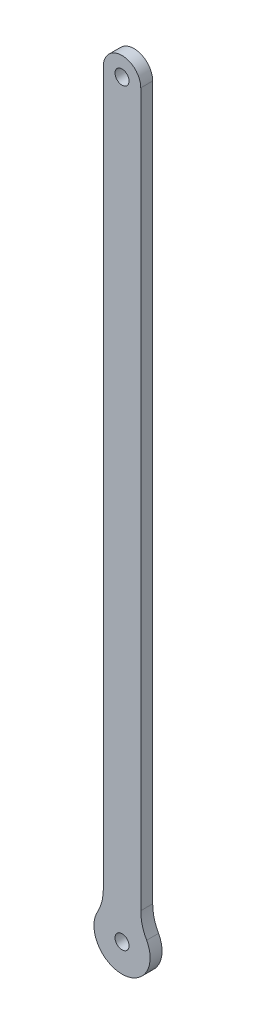
ISO-10303-21;
HEADER;
FILE_DESCRIPTION(('STEP AP214'),'2;1');
FILE_NAME('part.step','',(''),(''),'','','');
FILE_SCHEMA(('AUTOMOTIVE_DESIGN { 1 0 10303 214 1 1 1 1 }'));
ENDSEC;
DATA;
#1=APPLICATION_CONTEXT('core data for automotive mechanical design processes');
#2=APPLICATION_PROTOCOL_DEFINITION('international standard','automotive_design',2000,#1);
#3=PRODUCT_CONTEXT('',#1,'mechanical');
#4=PRODUCT('Part','Part','',(#3));
#5=PRODUCT_RELATED_PRODUCT_CATEGORY('part','',(#4));
#6=PRODUCT_DEFINITION_FORMATION('','',#4);
#7=PRODUCT_DEFINITION_CONTEXT('part definition',#1,'design');
#8=PRODUCT_DEFINITION('design','',#6,#7);
#9=PRODUCT_DEFINITION_SHAPE('','',#8);
#10=(LENGTH_UNIT() NAMED_UNIT(*) SI_UNIT(.MILLI.,.METRE.));
#11=(NAMED_UNIT(*) PLANE_ANGLE_UNIT() SI_UNIT($,.RADIAN.));
#12=(NAMED_UNIT(*) SI_UNIT($,.STERADIAN.) SOLID_ANGLE_UNIT());
#13=UNCERTAINTY_MEASURE_WITH_UNIT(LENGTH_MEASURE(1.E-05),#10,'distance_accuracy_value','');
#14=(GEOMETRIC_REPRESENTATION_CONTEXT(3) GLOBAL_UNCERTAINTY_ASSIGNED_CONTEXT((#13)) GLOBAL_UNIT_ASSIGNED_CONTEXT((#10,
#11,#12)) REPRESENTATION_CONTEXT('',''));
#15=CARTESIAN_POINT('',(0.,0.,0.));
#16=DIRECTION('',(0.,0.,1.));
#17=DIRECTION('',(1.,0.,0.));
#18=AXIS2_PLACEMENT_3D('',#15,#16,#17);
#19=CARTESIAN_POINT('',(-14.,7.74596669241483,2.55));
#20=DIRECTION('',(0.,0.,-1.));
#21=DIRECTION('',(-1.,0.,0.));
#22=AXIS2_PLACEMENT_3D('',#19,#20,#21);
#23=PLANE('',#22);
#24=CARTESIAN_POINT('',(0.,0.,2.55));
#25=DIRECTION('',(0.,0.,1.));
#26=DIRECTION('',(1.,0.,0.));
#27=AXIS2_PLACEMENT_3D('',#24,#25,#26);
#28=CIRCLE('',#27,1.5);
#29=CARTESIAN_POINT('',(1.5,0.,2.55));
#30=VERTEX_POINT('',#29);
#31=EDGE_CURVE('E124',#30,#30,#28,.T.);
#32=ORIENTED_EDGE('',*,*,#31,.F.);
#33=EDGE_LOOP('',(#32));
#34=FACE_BOUND('',#33,.T.);
#35=CARTESIAN_POINT('',(-14.,7.74596669241483,2.55));
#36=DIRECTION('',(0.,0.,-1.));
#37=DIRECTION('',(-1.,0.,0.));
#38=AXIS2_PLACEMENT_3D('',#35,#36,#37);
#39=CIRCLE('',#38,10.);
#40=CARTESIAN_POINT('',(-4.,7.74596669241483,2.55));
#41=VERTEX_POINT('',#40);
#42=CARTESIAN_POINT('',(-5.25,2.90473750965556,2.55));
#43=VERTEX_POINT('',#42);
#44=EDGE_CURVE('E133',#41,#43,#39,.T.);
#45=ORIENTED_EDGE('',*,*,#44,.T.);
#46=CARTESIAN_POINT('',(0.,0.,2.55));
#47=DIRECTION('',(0.,0.,1.));
#48=DIRECTION('',(1.,0.,0.));
#49=AXIS2_PLACEMENT_3D('',#46,#47,#48);
#50=CIRCLE('',#49,6.);
#51=CARTESIAN_POINT('',(5.25,2.90473750965557,2.55));
#52=VERTEX_POINT('',#51);
#53=EDGE_CURVE('E87',#43,#52,#50,.T.);
#54=ORIENTED_EDGE('',*,*,#53,.T.);
#55=CARTESIAN_POINT('',(14.,7.74596669241483,2.55));
#56=DIRECTION('',(0.,0.,-1.));
#57=DIRECTION('',(1.,0.,0.));
#58=AXIS2_PLACEMENT_3D('',#55,#56,#57);
#59=CIRCLE('',#58,10.);
#60=CARTESIAN_POINT('',(4.,7.74596669241483,2.55));
#61=VERTEX_POINT('',#60);
#62=EDGE_CURVE('E101',#52,#61,#59,.T.);
#63=ORIENTED_EDGE('',*,*,#62,.T.);
#64=DIRECTION('',(0.,1.,0.));
#65=VECTOR('',#64,1.);
#66=CARTESIAN_POINT('',(4.,8.78572403175326,2.55));
#67=LINE('',#66,#65);
#68=CARTESIAN_POINT('',(3.99999999999998,160.,2.55));
#69=VERTEX_POINT('',#68);
#70=EDGE_CURVE('E94',#61,#69,#67,.T.);
#71=ORIENTED_EDGE('',*,*,#70,.T.);
#72=CARTESIAN_POINT('',(0.,160.,2.55));
#73=DIRECTION('',(0.,0.,1.));
#74=DIRECTION('',(1.,0.,0.));
#75=AXIS2_PLACEMENT_3D('',#72,#73,#74);
#76=CIRCLE('',#75,4.);
#77=CARTESIAN_POINT('',(-4.00000000000002,160.,2.55));
#78=VERTEX_POINT('',#77);
#79=EDGE_CURVE('E98',#69,#78,#76,.T.);
#80=ORIENTED_EDGE('',*,*,#79,.T.);
#81=DIRECTION('',(0.,-1.,0.));
#82=VECTOR('',#81,1.);
#83=CARTESIAN_POINT('',(-4.00000000000002,160.,2.55));
#84=LINE('',#83,#82);
#85=EDGE_CURVE('E52',#78,#41,#84,.T.);
#86=ORIENTED_EDGE('',*,*,#85,.T.);
#87=EDGE_LOOP('',(#45,#54,#63,#71,#80,#86));
#88=FACE_BOUND('',#87,.T.);
#89=CARTESIAN_POINT('',(0.,160.,2.55));
#90=DIRECTION('',(0.,0.,1.));
#91=DIRECTION('',(1.,0.,0.));
#92=AXIS2_PLACEMENT_3D('',#89,#90,#91);
#93=CIRCLE('',#92,1.5);
#94=CARTESIAN_POINT('',(1.49999999999998,160.,2.55));
#95=VERTEX_POINT('',#94);
#96=EDGE_CURVE('E152',#95,#95,#93,.T.);
#97=ORIENTED_EDGE('',*,*,#96,.F.);
#98=EDGE_LOOP('',(#97));
#99=FACE_BOUND('',#98,.T.);
#100=ADVANCED_FACE('F35',(#34,#88,#99),#23,.F.);
#101=CARTESIAN_POINT('',(-14.,7.74596669241483,0.));
#102=DIRECTION('',(0.,0.,-1.));
#103=DIRECTION('',(-1.,0.,0.));
#104=AXIS2_PLACEMENT_3D('',#101,#102,#103);
#105=PLANE('',#104);
#106=CARTESIAN_POINT('',(0.,0.,0.));
#107=DIRECTION('',(0.,0.,1.));
#108=DIRECTION('',(1.,0.,0.));
#109=AXIS2_PLACEMENT_3D('',#106,#107,#108);
#110=CIRCLE('',#109,1.5);
#111=CARTESIAN_POINT('',(1.5,0.,0.));
#112=VERTEX_POINT('',#111);
#113=EDGE_CURVE('E149',#112,#112,#110,.T.);
#114=ORIENTED_EDGE('',*,*,#113,.T.);
#115=EDGE_LOOP('',(#114));
#116=FACE_BOUND('',#115,.T.);
#117=CARTESIAN_POINT('',(-14.,7.74596669241483,0.));
#118=DIRECTION('',(0.,0.,-1.));
#119=DIRECTION('',(-1.,0.,0.));
#120=AXIS2_PLACEMENT_3D('',#117,#118,#119);
#121=CIRCLE('',#120,10.);
#122=CARTESIAN_POINT('',(-4.,7.74596669241483,0.));
#123=VERTEX_POINT('',#122);
#124=CARTESIAN_POINT('',(-5.25,2.90473750965556,0.));
#125=VERTEX_POINT('',#124);
#126=EDGE_CURVE('E120',#123,#125,#121,.T.);
#127=ORIENTED_EDGE('',*,*,#126,.F.);
#128=DIRECTION('',(0.,-1.,0.));
#129=VECTOR('',#128,1.);
#130=CARTESIAN_POINT('',(-4.,8.51201139225442,0.));
#131=LINE('',#130,#129);
#132=CARTESIAN_POINT('',(-4.00000000000002,160.,0.));
#133=VERTEX_POINT('',#132);
#134=EDGE_CURVE('E75',#133,#123,#131,.T.);
#135=ORIENTED_EDGE('',*,*,#134,.F.);
#136=CARTESIAN_POINT('',(0.,160.,0.));
#137=DIRECTION('',(0.,0.,1.));
#138=DIRECTION('',(1.,0.,0.));
#139=AXIS2_PLACEMENT_3D('',#136,#137,#138);
#140=CIRCLE('',#139,4.);
#141=CARTESIAN_POINT('',(3.99999999999998,160.,0.));
#142=VERTEX_POINT('',#141);
#143=EDGE_CURVE('E130',#142,#133,#140,.T.);
#144=ORIENTED_EDGE('',*,*,#143,.F.);
#145=DIRECTION('',(0.,1.,0.));
#146=VECTOR('',#145,1.);
#147=CARTESIAN_POINT('',(3.99999999999998,160.,0.));
#148=LINE('',#147,#146);
#149=CARTESIAN_POINT('',(4.,7.74596669241483,0.));
#150=VERTEX_POINT('',#149);
#151=EDGE_CURVE('E109',#150,#142,#148,.T.);
#152=ORIENTED_EDGE('',*,*,#151,.F.);
#153=CARTESIAN_POINT('',(14.,7.74596669241483,0.));
#154=DIRECTION('',(0.,0.,-1.));
#155=DIRECTION('',(1.,0.,0.));
#156=AXIS2_PLACEMENT_3D('',#153,#154,#155);
#157=CIRCLE('',#156,10.);
#158=CARTESIAN_POINT('',(5.25,2.90473750965557,0.));
#159=VERTEX_POINT('',#158);
#160=EDGE_CURVE('E126',#159,#150,#157,.T.);
#161=ORIENTED_EDGE('',*,*,#160,.F.);
#162=CARTESIAN_POINT('',(0.,0.,0.));
#163=DIRECTION('',(0.,0.,1.));
#164=DIRECTION('',(1.,0.,0.));
#165=AXIS2_PLACEMENT_3D('',#162,#163,#164);
#166=CIRCLE('',#165,6.);
#167=EDGE_CURVE('E123',#125,#159,#166,.T.);
#168=ORIENTED_EDGE('',*,*,#167,.F.);
#169=EDGE_LOOP('',(#127,#135,#144,#152,#161,#168));
#170=FACE_BOUND('',#169,.T.);
#171=CARTESIAN_POINT('',(0.,160.,0.));
#172=DIRECTION('',(0.,0.,1.));
#173=DIRECTION('',(1.,0.,0.));
#174=AXIS2_PLACEMENT_3D('',#171,#172,#173);
#175=CIRCLE('',#174,1.5);
#176=CARTESIAN_POINT('',(1.49999999999998,160.,0.));
#177=VERTEX_POINT('',#176);
#178=EDGE_CURVE('E155',#177,#177,#175,.T.);
#179=ORIENTED_EDGE('',*,*,#178,.T.);
#180=EDGE_LOOP('',(#179));
#181=FACE_BOUND('',#180,.T.);
#182=ADVANCED_FACE('F140',(#116,#170,#181),#105,.T.);
#183=CARTESIAN_POINT('',(-14.,7.74596669241483,2.55));
#184=DIRECTION('',(0.,0.,-1.));
#185=DIRECTION('',(-1.,0.,0.));
#186=AXIS2_PLACEMENT_3D('',#183,#184,#185);
#187=CYLINDRICAL_SURFACE('',#186,10.);
#188=ORIENTED_EDGE('',*,*,#126,.T.);
#189=DIRECTION('',(0.,0.,-1.));
#190=VECTOR('',#189,1.);
#191=CARTESIAN_POINT('',(-5.25,2.90473750965556,2.55));
#192=LINE('',#191,#190);
#193=EDGE_CURVE('E11',#43,#125,#192,.T.);
#194=ORIENTED_EDGE('',*,*,#193,.F.);
#195=ORIENTED_EDGE('',*,*,#44,.F.);
#196=DIRECTION('',(0.,0.,-1.));
#197=VECTOR('',#196,1.);
#198=CARTESIAN_POINT('',(-4.,7.74596669241483,2.55));
#199=LINE('',#198,#197);
#200=EDGE_CURVE('E116',#41,#123,#199,.T.);
#201=ORIENTED_EDGE('',*,*,#200,.T.);
#202=EDGE_LOOP('',(#188,#194,#195,#201));
#203=FACE_BOUND('',#202,.T.);
#204=ADVANCED_FACE('F37',(#203),#187,.F.);
#205=CARTESIAN_POINT('',(0.,0.,2.55));
#206=DIRECTION('',(0.,0.,-1.));
#207=DIRECTION('',(-1.,0.,0.));
#208=AXIS2_PLACEMENT_3D('',#205,#206,#207);
#209=CYLINDRICAL_SURFACE('',#208,6.);
#210=ORIENTED_EDGE('',*,*,#167,.T.);
#211=DIRECTION('',(0.,0.,-1.));
#212=VECTOR('',#211,1.);
#213=CARTESIAN_POINT('',(5.25,2.90473750965557,2.55));
#214=LINE('',#213,#212);
#215=EDGE_CURVE('E44',#52,#159,#214,.T.);
#216=ORIENTED_EDGE('',*,*,#215,.F.);
#217=ORIENTED_EDGE('',*,*,#53,.F.);
#218=ORIENTED_EDGE('',*,*,#193,.T.);
#219=EDGE_LOOP('',(#210,#216,#217,#218));
#220=FACE_BOUND('',#219,.T.);
#221=ADVANCED_FACE('F183',(#220),#209,.T.);
#222=CARTESIAN_POINT('',(14.,7.74596669241483,2.55));
#223=DIRECTION('',(0.,0.,-1.));
#224=DIRECTION('',(-1.,0.,0.));
#225=AXIS2_PLACEMENT_3D('',#222,#223,#224);
#226=CYLINDRICAL_SURFACE('',#225,10.);
#227=ORIENTED_EDGE('',*,*,#160,.T.);
#228=DIRECTION('',(0.,0.,-1.));
#229=VECTOR('',#228,1.);
#230=CARTESIAN_POINT('',(4.,7.74596669241483,2.55));
#231=LINE('',#230,#229);
#232=EDGE_CURVE('E111',#61,#150,#231,.T.);
#233=ORIENTED_EDGE('',*,*,#232,.F.);
#234=ORIENTED_EDGE('',*,*,#62,.F.);
#235=ORIENTED_EDGE('',*,*,#215,.T.);
#236=EDGE_LOOP('',(#227,#233,#234,#235));
#237=FACE_BOUND('',#236,.T.);
#238=ADVANCED_FACE('F139',(#237),#226,.F.);
#239=CARTESIAN_POINT('',(3.99999999999998,160.,2.55));
#240=DIRECTION('',(-1.,0.,0.));
#241=DIRECTION('',(0.,-1.,0.));
#242=AXIS2_PLACEMENT_3D('',#239,#240,#241);
#243=PLANE('',#242);
#244=ORIENTED_EDGE('',*,*,#151,.T.);
#245=DIRECTION('',(0.,0.,-1.));
#246=VECTOR('',#245,1.);
#247=CARTESIAN_POINT('',(3.99999999999998,160.,2.55));
#248=LINE('',#247,#246);
#249=EDGE_CURVE('E107',#69,#142,#248,.T.);
#250=ORIENTED_EDGE('',*,*,#249,.F.);
#251=ORIENTED_EDGE('',*,*,#70,.F.);
#252=ORIENTED_EDGE('',*,*,#232,.T.);
#253=EDGE_LOOP('',(#244,#250,#251,#252));
#254=FACE_BOUND('',#253,.T.);
#255=ADVANCED_FACE('F108',(#254),#243,.F.);
#256=CARTESIAN_POINT('',(0.,160.,2.55));
#257=DIRECTION('',(0.,0.,-1.));
#258=DIRECTION('',(-1.,0.,0.));
#259=AXIS2_PLACEMENT_3D('',#256,#257,#258);
#260=CYLINDRICAL_SURFACE('',#259,4.);
#261=ORIENTED_EDGE('',*,*,#143,.T.);
#262=DIRECTION('',(0.,0.,-1.));
#263=VECTOR('',#262,1.);
#264=CARTESIAN_POINT('',(-4.00000000000002,160.,2.55));
#265=LINE('',#264,#263);
#266=EDGE_CURVE('E112',#78,#133,#265,.T.);
#267=ORIENTED_EDGE('',*,*,#266,.F.);
#268=ORIENTED_EDGE('',*,*,#79,.F.);
#269=ORIENTED_EDGE('',*,*,#249,.T.);
#270=EDGE_LOOP('',(#261,#267,#268,#269));
#271=FACE_BOUND('',#270,.T.);
#272=ADVANCED_FACE('F114',(#271),#260,.T.);
#273=CARTESIAN_POINT('',(-4.,8.51201139225442,2.55));
#274=DIRECTION('',(1.,0.,0.));
#275=DIRECTION('',(0.,0.,-1.));
#276=AXIS2_PLACEMENT_3D('',#273,#274,#275);
#277=PLANE('',#276);
#278=ORIENTED_EDGE('',*,*,#134,.T.);
#279=ORIENTED_EDGE('',*,*,#200,.F.);
#280=ORIENTED_EDGE('',*,*,#85,.F.);
#281=ORIENTED_EDGE('',*,*,#266,.T.);
#282=EDGE_LOOP('',(#278,#279,#280,#281));
#283=FACE_BOUND('',#282,.T.);
#284=ADVANCED_FACE('F142',(#283),#277,.F.);
#285=CARTESIAN_POINT('',(0.,0.,2.55));
#286=DIRECTION('',(0.,0.,-1.));
#287=DIRECTION('',(-1.,0.,0.));
#288=AXIS2_PLACEMENT_3D('',#285,#286,#287);
#289=CYLINDRICAL_SURFACE('',#288,1.5);
#290=ORIENTED_EDGE('',*,*,#31,.T.);
#291=EDGE_LOOP('',(#290));
#292=FACE_BOUND('',#291,.T.);
#293=ORIENTED_EDGE('',*,*,#113,.F.);
#294=EDGE_LOOP('',(#293));
#295=FACE_BOUND('',#294,.T.);
#296=ADVANCED_FACE('F173',(#292,#295),#289,.F.);
#297=CARTESIAN_POINT('',(0.,160.,2.55));
#298=DIRECTION('',(0.,0.,-1.));
#299=DIRECTION('',(-1.,0.,0.));
#300=AXIS2_PLACEMENT_3D('',#297,#298,#299);
#301=CYLINDRICAL_SURFACE('',#300,1.5);
#302=ORIENTED_EDGE('',*,*,#96,.T.);
#303=EDGE_LOOP('',(#302));
#304=FACE_BOUND('',#303,.T.);
#305=ORIENTED_EDGE('',*,*,#178,.F.);
#306=EDGE_LOOP('',(#305));
#307=FACE_BOUND('',#306,.T.);
#308=ADVANCED_FACE('F161',(#304,#307),#301,.F.);
#309=CLOSED_SHELL('',(#100,#182,#204,#221,#238,#255,#272,#284,#296,#308));
#310=MANIFOLD_SOLID_BREP('B2',#309);
#311=ADVANCED_BREP_SHAPE_REPRESENTATION('',(#18,#310),#14);
#312=SHAPE_DEFINITION_REPRESENTATION(#9,#311);
ENDSEC;
END-ISO-10303-21;
